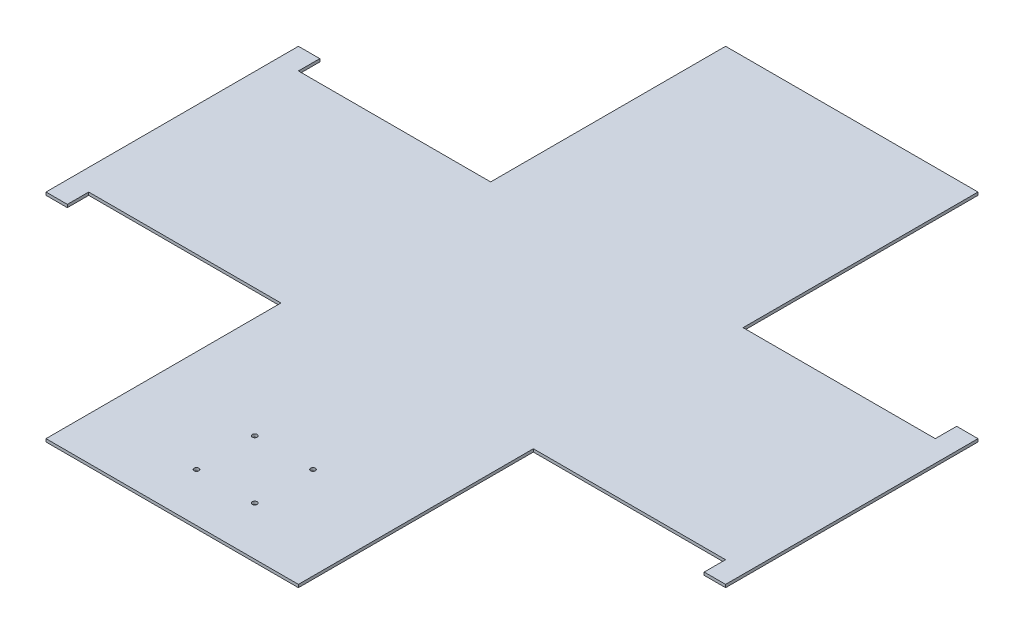
ISO-10303-21;
HEADER;
FILE_DESCRIPTION(('STEP AP214'),'2;1');
FILE_NAME('part.step','',(''),(''),'','','');
FILE_SCHEMA(('AUTOMOTIVE_DESIGN { 1 0 10303 214 1 1 1 1 }'));
ENDSEC;
DATA;
#1=APPLICATION_CONTEXT('core data for automotive mechanical design processes');
#2=APPLICATION_PROTOCOL_DEFINITION('international standard','automotive_design',2000,#1);
#3=PRODUCT_CONTEXT('',#1,'mechanical');
#4=PRODUCT('Part','Part','',(#3));
#5=PRODUCT_RELATED_PRODUCT_CATEGORY('part','',(#4));
#6=PRODUCT_DEFINITION_FORMATION('','',#4);
#7=PRODUCT_DEFINITION_CONTEXT('part definition',#1,'design');
#8=PRODUCT_DEFINITION('design','',#6,#7);
#9=PRODUCT_DEFINITION_SHAPE('','',#8);
#10=(LENGTH_UNIT() NAMED_UNIT(*) SI_UNIT(.MILLI.,.METRE.));
#11=(NAMED_UNIT(*) PLANE_ANGLE_UNIT() SI_UNIT($,.RADIAN.));
#12=(NAMED_UNIT(*) SI_UNIT($,.STERADIAN.) SOLID_ANGLE_UNIT());
#13=UNCERTAINTY_MEASURE_WITH_UNIT(LENGTH_MEASURE(1.E-05),#10,'distance_accuracy_value','');
#14=(GEOMETRIC_REPRESENTATION_CONTEXT(3) GLOBAL_UNCERTAINTY_ASSIGNED_CONTEXT((#13)) GLOBAL_UNIT_ASSIGNED_CONTEXT((#10,
#11,#12)) REPRESENTATION_CONTEXT('',''));
#15=CARTESIAN_POINT('',(0.,0.,0.));
#16=DIRECTION('',(0.,0.,1.));
#17=DIRECTION('',(1.,0.,0.));
#18=AXIS2_PLACEMENT_3D('',#15,#16,#17);
#19=CARTESIAN_POINT('',(-328.,3.,-108.));
#20=DIRECTION('',(0.,0.,1.));
#21=DIRECTION('',(1.,0.,0.));
#22=AXIS2_PLACEMENT_3D('',#19,#20,#21);
#23=PLANE('',#22);
#24=DIRECTION('',(-1.,0.,0.));
#25=VECTOR('',#24,1.);
#26=CARTESIAN_POINT('',(-328.,0.,-108.));
#27=LINE('',#26,#25);
#28=CARTESIAN_POINT('',(-130.,0.,-108.));
#29=VERTEX_POINT('',#28);
#30=CARTESIAN_POINT('',(-328.,0.,-108.));
#31=VERTEX_POINT('',#30);
#32=EDGE_CURVE('E211',#29,#31,#27,.T.);
#33=ORIENTED_EDGE('',*,*,#32,.T.);
#34=DIRECTION('',(0.,-1.,0.));
#35=VECTOR('',#34,1.);
#36=CARTESIAN_POINT('',(-328.,3.,-108.));
#37=LINE('',#36,#35);
#38=CARTESIAN_POINT('',(-328.,3.,-108.));
#39=VERTEX_POINT('',#38);
#40=EDGE_CURVE('E47',#39,#31,#37,.T.);
#41=ORIENTED_EDGE('',*,*,#40,.F.);
#42=DIRECTION('',(-1.,0.,0.));
#43=VECTOR('',#42,1.);
#44=CARTESIAN_POINT('',(-328.,3.,-108.));
#45=LINE('',#44,#43);
#46=CARTESIAN_POINT('',(-130.,3.,-108.));
#47=VERTEX_POINT('',#46);
#48=EDGE_CURVE('E134',#47,#39,#45,.T.);
#49=ORIENTED_EDGE('',*,*,#48,.F.);
#50=DIRECTION('',(0.,-1.,0.));
#51=VECTOR('',#50,1.);
#52=CARTESIAN_POINT('',(-130.,3.,-108.));
#53=LINE('',#52,#51);
#54=EDGE_CURVE('E11',#47,#29,#53,.T.);
#55=ORIENTED_EDGE('',*,*,#54,.T.);
#56=EDGE_LOOP('',(#33,#41,#49,#55));
#57=FACE_BOUND('',#56,.T.);
#58=ADVANCED_FACE('F39',(#57),#23,.F.);
#59=CARTESIAN_POINT('',(-328.,3.,-130.));
#60=DIRECTION('',(-1.,0.,0.));
#61=DIRECTION('',(0.,0.,1.));
#62=AXIS2_PLACEMENT_3D('',#59,#60,#61);
#63=PLANE('',#62);
#64=DIRECTION('',(0.,0.,-1.));
#65=VECTOR('',#64,1.);
#66=CARTESIAN_POINT('',(-328.,0.,-130.));
#67=LINE('',#66,#65);
#68=CARTESIAN_POINT('',(-328.,0.,-130.));
#69=VERTEX_POINT('',#68);
#70=EDGE_CURVE('E213',#31,#69,#67,.T.);
#71=ORIENTED_EDGE('',*,*,#70,.T.);
#72=DIRECTION('',(0.,-1.,0.));
#73=VECTOR('',#72,1.);
#74=CARTESIAN_POINT('',(-328.,3.,-130.));
#75=LINE('',#74,#73);
#76=CARTESIAN_POINT('',(-328.,3.,-130.));
#77=VERTEX_POINT('',#76);
#78=EDGE_CURVE('E293',#77,#69,#75,.T.);
#79=ORIENTED_EDGE('',*,*,#78,.F.);
#80=DIRECTION('',(0.,0.,-1.));
#81=VECTOR('',#80,1.);
#82=CARTESIAN_POINT('',(-328.,3.,-130.));
#83=LINE('',#82,#81);
#84=EDGE_CURVE('E301',#39,#77,#83,.T.);
#85=ORIENTED_EDGE('',*,*,#84,.F.);
#86=ORIENTED_EDGE('',*,*,#40,.T.);
#87=EDGE_LOOP('',(#71,#79,#85,#86));
#88=FACE_BOUND('',#87,.T.);
#89=ADVANCED_FACE('F299',(#88),#63,.F.);
#90=CARTESIAN_POINT('',(-350.,3.,-130.));
#91=DIRECTION('',(0.,0.,1.));
#92=DIRECTION('',(1.,0.,0.));
#93=AXIS2_PLACEMENT_3D('',#90,#91,#92);
#94=PLANE('',#93);
#95=DIRECTION('',(-1.,0.,0.));
#96=VECTOR('',#95,1.);
#97=CARTESIAN_POINT('',(-350.,0.,-130.));
#98=LINE('',#97,#96);
#99=CARTESIAN_POINT('',(-350.,0.,-130.));
#100=VERTEX_POINT('',#99);
#101=EDGE_CURVE('E216',#69,#100,#98,.T.);
#102=ORIENTED_EDGE('',*,*,#101,.T.);
#103=DIRECTION('',(0.,-1.,0.));
#104=VECTOR('',#103,1.);
#105=CARTESIAN_POINT('',(-350.,3.,-130.));
#106=LINE('',#105,#104);
#107=CARTESIAN_POINT('',(-350.,3.,-130.));
#108=VERTEX_POINT('',#107);
#109=EDGE_CURVE('E290',#108,#100,#106,.T.);
#110=ORIENTED_EDGE('',*,*,#109,.F.);
#111=DIRECTION('',(-1.,0.,0.));
#112=VECTOR('',#111,1.);
#113=CARTESIAN_POINT('',(-350.,3.,-130.));
#114=LINE('',#113,#112);
#115=EDGE_CURVE('E320',#77,#108,#114,.T.);
#116=ORIENTED_EDGE('',*,*,#115,.F.);
#117=ORIENTED_EDGE('',*,*,#78,.T.);
#118=EDGE_LOOP('',(#102,#110,#116,#117));
#119=FACE_BOUND('',#118,.T.);
#120=ADVANCED_FACE('F311',(#119),#94,.F.);
#121=CARTESIAN_POINT('',(-350.,3.,130.));
#122=DIRECTION('',(1.,0.,0.));
#123=DIRECTION('',(0.,0.,-1.));
#124=AXIS2_PLACEMENT_3D('',#121,#122,#123);
#125=PLANE('',#124);
#126=DIRECTION('',(0.,0.,1.));
#127=VECTOR('',#126,1.);
#128=CARTESIAN_POINT('',(-350.,0.,130.));
#129=LINE('',#128,#127);
#130=CARTESIAN_POINT('',(-350.,0.,130.));
#131=VERTEX_POINT('',#130);
#132=EDGE_CURVE('E218',#100,#131,#129,.T.);
#133=ORIENTED_EDGE('',*,*,#132,.T.);
#134=DIRECTION('',(0.,-1.,0.));
#135=VECTOR('',#134,1.);
#136=CARTESIAN_POINT('',(-350.,3.,130.));
#137=LINE('',#136,#135);
#138=CARTESIAN_POINT('',(-350.,3.,130.));
#139=VERTEX_POINT('',#138);
#140=EDGE_CURVE('E287',#139,#131,#137,.T.);
#141=ORIENTED_EDGE('',*,*,#140,.F.);
#142=DIRECTION('',(0.,0.,1.));
#143=VECTOR('',#142,1.);
#144=CARTESIAN_POINT('',(-350.,3.,130.));
#145=LINE('',#144,#143);
#146=EDGE_CURVE('E317',#108,#139,#145,.T.);
#147=ORIENTED_EDGE('',*,*,#146,.F.);
#148=ORIENTED_EDGE('',*,*,#109,.T.);
#149=EDGE_LOOP('',(#133,#141,#147,#148));
#150=FACE_BOUND('',#149,.T.);
#151=ADVANCED_FACE('F315',(#150),#125,.F.);
#152=CARTESIAN_POINT('',(-350.,3.,130.));
#153=DIRECTION('',(0.,0.,-1.));
#154=DIRECTION('',(-1.,0.,0.));
#155=AXIS2_PLACEMENT_3D('',#152,#153,#154);
#156=PLANE('',#155);
#157=DIRECTION('',(1.,0.,0.));
#158=VECTOR('',#157,1.);
#159=CARTESIAN_POINT('',(-350.,0.,130.));
#160=LINE('',#159,#158);
#161=CARTESIAN_POINT('',(-328.,0.,130.));
#162=VERTEX_POINT('',#161);
#163=EDGE_CURVE('E220',#131,#162,#160,.T.);
#164=ORIENTED_EDGE('',*,*,#163,.T.);
#165=DIRECTION('',(0.,-1.,0.));
#166=VECTOR('',#165,1.);
#167=CARTESIAN_POINT('',(-328.,3.,130.));
#168=LINE('',#167,#166);
#169=CARTESIAN_POINT('',(-328.,3.,130.));
#170=VERTEX_POINT('',#169);
#171=EDGE_CURVE('E284',#170,#162,#168,.T.);
#172=ORIENTED_EDGE('',*,*,#171,.F.);
#173=DIRECTION('',(1.,0.,0.));
#174=VECTOR('',#173,1.);
#175=CARTESIAN_POINT('',(-350.,3.,130.));
#176=LINE('',#175,#174);
#177=EDGE_CURVE('E319',#139,#170,#176,.T.);
#178=ORIENTED_EDGE('',*,*,#177,.F.);
#179=ORIENTED_EDGE('',*,*,#140,.T.);
#180=EDGE_LOOP('',(#164,#172,#178,#179));
#181=FACE_BOUND('',#180,.T.);
#182=ADVANCED_FACE('F416',(#181),#156,.F.);
#183=CARTESIAN_POINT('',(-328.,3.,108.));
#184=DIRECTION('',(-1.,0.,0.));
#185=DIRECTION('',(0.,0.,1.));
#186=AXIS2_PLACEMENT_3D('',#183,#184,#185);
#187=PLANE('',#186);
#188=DIRECTION('',(0.,0.,-1.));
#189=VECTOR('',#188,1.);
#190=CARTESIAN_POINT('',(-328.,0.,108.));
#191=LINE('',#190,#189);
#192=CARTESIAN_POINT('',(-328.,0.,108.));
#193=VERTEX_POINT('',#192);
#194=EDGE_CURVE('E222',#162,#193,#191,.T.);
#195=ORIENTED_EDGE('',*,*,#194,.T.);
#196=DIRECTION('',(0.,-1.,0.));
#197=VECTOR('',#196,1.);
#198=CARTESIAN_POINT('',(-328.,3.,108.));
#199=LINE('',#198,#197);
#200=CARTESIAN_POINT('',(-328.,3.,108.));
#201=VERTEX_POINT('',#200);
#202=EDGE_CURVE('E281',#201,#193,#199,.T.);
#203=ORIENTED_EDGE('',*,*,#202,.F.);
#204=DIRECTION('',(0.,0.,-1.));
#205=VECTOR('',#204,1.);
#206=CARTESIAN_POINT('',(-328.,3.,108.));
#207=LINE('',#206,#205);
#208=EDGE_CURVE('E322',#170,#201,#207,.T.);
#209=ORIENTED_EDGE('',*,*,#208,.F.);
#210=ORIENTED_EDGE('',*,*,#171,.T.);
#211=EDGE_LOOP('',(#195,#203,#209,#210));
#212=FACE_BOUND('',#211,.T.);
#213=ADVANCED_FACE('F419',(#212),#187,.F.);
#214=CARTESIAN_POINT('',(-328.,3.,108.));
#215=DIRECTION('',(0.,0.,-1.));
#216=DIRECTION('',(-1.,0.,0.));
#217=AXIS2_PLACEMENT_3D('',#214,#215,#216);
#218=PLANE('',#217);
#219=DIRECTION('',(1.,0.,0.));
#220=VECTOR('',#219,1.);
#221=CARTESIAN_POINT('',(-328.,0.,108.));
#222=LINE('',#221,#220);
#223=CARTESIAN_POINT('',(-130.,0.,108.));
#224=VERTEX_POINT('',#223);
#225=EDGE_CURVE('E224',#193,#224,#222,.T.);
#226=ORIENTED_EDGE('',*,*,#225,.T.);
#227=DIRECTION('',(0.,-1.,0.));
#228=VECTOR('',#227,1.);
#229=CARTESIAN_POINT('',(-130.,3.,108.));
#230=LINE('',#229,#228);
#231=CARTESIAN_POINT('',(-130.,3.,108.));
#232=VERTEX_POINT('',#231);
#233=EDGE_CURVE('E278',#232,#224,#230,.T.);
#234=ORIENTED_EDGE('',*,*,#233,.F.);
#235=DIRECTION('',(1.,0.,0.));
#236=VECTOR('',#235,1.);
#237=CARTESIAN_POINT('',(-328.,3.,108.));
#238=LINE('',#237,#236);
#239=EDGE_CURVE('E328',#201,#232,#238,.T.);
#240=ORIENTED_EDGE('',*,*,#239,.F.);
#241=ORIENTED_EDGE('',*,*,#202,.T.);
#242=EDGE_LOOP('',(#226,#234,#240,#241));
#243=FACE_BOUND('',#242,.T.);
#244=ADVANCED_FACE('F423',(#243),#218,.F.);
#245=CARTESIAN_POINT('',(-130.,3.,130.));
#246=DIRECTION('',(1.,0.,0.));
#247=DIRECTION('',(0.,0.,-1.));
#248=AXIS2_PLACEMENT_3D('',#245,#246,#247);
#249=PLANE('',#248);
#250=DIRECTION('',(0.,0.,1.));
#251=VECTOR('',#250,1.);
#252=CARTESIAN_POINT('',(-130.,0.,130.));
#253=LINE('',#252,#251);
#254=CARTESIAN_POINT('',(-130.,0.,350.));
#255=VERTEX_POINT('',#254);
#256=EDGE_CURVE('E227',#224,#255,#253,.T.);
#257=ORIENTED_EDGE('',*,*,#256,.T.);
#258=DIRECTION('',(0.,-1.,0.));
#259=VECTOR('',#258,1.);
#260=CARTESIAN_POINT('',(-130.,3.,350.));
#261=LINE('',#260,#259);
#262=CARTESIAN_POINT('',(-130.,3.,350.));
#263=VERTEX_POINT('',#262);
#264=EDGE_CURVE('E275',#263,#255,#261,.T.);
#265=ORIENTED_EDGE('',*,*,#264,.F.);
#266=DIRECTION('',(0.,0.,1.));
#267=VECTOR('',#266,1.);
#268=CARTESIAN_POINT('',(-130.,3.,108.));
#269=LINE('',#268,#267);
#270=EDGE_CURVE('E330',#232,#263,#269,.T.);
#271=ORIENTED_EDGE('',*,*,#270,.F.);
#272=ORIENTED_EDGE('',*,*,#233,.T.);
#273=EDGE_LOOP('',(#257,#265,#271,#272));
#274=FACE_BOUND('',#273,.T.);
#275=ADVANCED_FACE('F427',(#274),#249,.F.);
#276=CARTESIAN_POINT('',(-130.,3.,350.));
#277=DIRECTION('',(0.,0.,-1.));
#278=DIRECTION('',(-1.,0.,0.));
#279=AXIS2_PLACEMENT_3D('',#276,#277,#278);
#280=PLANE('',#279);
#281=DIRECTION('',(1.,0.,0.));
#282=VECTOR('',#281,1.);
#283=CARTESIAN_POINT('',(-130.,0.,350.));
#284=LINE('',#283,#282);
#285=CARTESIAN_POINT('',(130.,0.,350.));
#286=VERTEX_POINT('',#285);
#287=EDGE_CURVE('E229',#255,#286,#284,.T.);
#288=ORIENTED_EDGE('',*,*,#287,.T.);
#289=DIRECTION('',(0.,-1.,0.));
#290=VECTOR('',#289,1.);
#291=CARTESIAN_POINT('',(130.,3.,350.));
#292=LINE('',#291,#290);
#293=CARTESIAN_POINT('',(130.,3.,350.));
#294=VERTEX_POINT('',#293);
#295=EDGE_CURVE('E272',#294,#286,#292,.T.);
#296=ORIENTED_EDGE('',*,*,#295,.F.);
#297=DIRECTION('',(1.,0.,0.));
#298=VECTOR('',#297,1.);
#299=CARTESIAN_POINT('',(-130.,3.,350.));
#300=LINE('',#299,#298);
#301=EDGE_CURVE('E332',#263,#294,#300,.T.);
#302=ORIENTED_EDGE('',*,*,#301,.F.);
#303=ORIENTED_EDGE('',*,*,#264,.T.);
#304=EDGE_LOOP('',(#288,#296,#302,#303));
#305=FACE_BOUND('',#304,.T.);
#306=ADVANCED_FACE('F431',(#305),#280,.F.);
#307=CARTESIAN_POINT('',(130.,3.,108.));
#308=DIRECTION('',(-1.,0.,0.));
#309=DIRECTION('',(0.,0.,1.));
#310=AXIS2_PLACEMENT_3D('',#307,#308,#309);
#311=PLANE('',#310);
#312=DIRECTION('',(0.,0.,-1.));
#313=VECTOR('',#312,1.);
#314=CARTESIAN_POINT('',(130.,0.,108.));
#315=LINE('',#314,#313);
#316=CARTESIAN_POINT('',(130.,0.,108.));
#317=VERTEX_POINT('',#316);
#318=EDGE_CURVE('E232',#286,#317,#315,.T.);
#319=ORIENTED_EDGE('',*,*,#318,.T.);
#320=DIRECTION('',(0.,-1.,0.));
#321=VECTOR('',#320,1.);
#322=CARTESIAN_POINT('',(130.,3.,108.));
#323=LINE('',#322,#321);
#324=CARTESIAN_POINT('',(130.,3.,108.));
#325=VERTEX_POINT('',#324);
#326=EDGE_CURVE('E269',#325,#317,#323,.T.);
#327=ORIENTED_EDGE('',*,*,#326,.F.);
#328=DIRECTION('',(0.,0.,-1.));
#329=VECTOR('',#328,1.);
#330=CARTESIAN_POINT('',(130.,3.,130.));
#331=LINE('',#330,#329);
#332=EDGE_CURVE('E334',#294,#325,#331,.T.);
#333=ORIENTED_EDGE('',*,*,#332,.F.);
#334=ORIENTED_EDGE('',*,*,#295,.T.);
#335=EDGE_LOOP('',(#319,#327,#333,#334));
#336=FACE_BOUND('',#335,.T.);
#337=ADVANCED_FACE('F435',(#336),#311,.F.);
#338=CARTESIAN_POINT('',(130.,3.,108.));
#339=DIRECTION('',(0.,0.,-1.));
#340=DIRECTION('',(-1.,0.,0.));
#341=AXIS2_PLACEMENT_3D('',#338,#339,#340);
#342=PLANE('',#341);
#343=DIRECTION('',(1.,0.,0.));
#344=VECTOR('',#343,1.);
#345=CARTESIAN_POINT('',(130.,0.,108.));
#346=LINE('',#345,#344);
#347=CARTESIAN_POINT('',(328.,0.,108.));
#348=VERTEX_POINT('',#347);
#349=EDGE_CURVE('E234',#317,#348,#346,.T.);
#350=ORIENTED_EDGE('',*,*,#349,.T.);
#351=DIRECTION('',(0.,-1.,0.));
#352=VECTOR('',#351,1.);
#353=CARTESIAN_POINT('',(328.,3.,108.));
#354=LINE('',#353,#352);
#355=CARTESIAN_POINT('',(328.,3.,108.));
#356=VERTEX_POINT('',#355);
#357=EDGE_CURVE('E266',#356,#348,#354,.T.);
#358=ORIENTED_EDGE('',*,*,#357,.F.);
#359=DIRECTION('',(1.,0.,0.));
#360=VECTOR('',#359,1.);
#361=CARTESIAN_POINT('',(130.,3.,108.));
#362=LINE('',#361,#360);
#363=EDGE_CURVE('E336',#325,#356,#362,.T.);
#364=ORIENTED_EDGE('',*,*,#363,.F.);
#365=ORIENTED_EDGE('',*,*,#326,.T.);
#366=EDGE_LOOP('',(#350,#358,#364,#365));
#367=FACE_BOUND('',#366,.T.);
#368=ADVANCED_FACE('F439',(#367),#342,.F.);
#369=CARTESIAN_POINT('',(328.,3.,108.));
#370=DIRECTION('',(1.,0.,0.));
#371=DIRECTION('',(0.,0.,-1.));
#372=AXIS2_PLACEMENT_3D('',#369,#370,#371);
#373=PLANE('',#372);
#374=DIRECTION('',(0.,0.,1.));
#375=VECTOR('',#374,1.);
#376=CARTESIAN_POINT('',(328.,0.,108.));
#377=LINE('',#376,#375);
#378=CARTESIAN_POINT('',(328.,0.,130.));
#379=VERTEX_POINT('',#378);
#380=EDGE_CURVE('E236',#348,#379,#377,.T.);
#381=ORIENTED_EDGE('',*,*,#380,.T.);
#382=DIRECTION('',(0.,-1.,0.));
#383=VECTOR('',#382,1.);
#384=CARTESIAN_POINT('',(328.,3.,130.));
#385=LINE('',#384,#383);
#386=CARTESIAN_POINT('',(328.,3.,130.));
#387=VERTEX_POINT('',#386);
#388=EDGE_CURVE('E263',#387,#379,#385,.T.);
#389=ORIENTED_EDGE('',*,*,#388,.F.);
#390=DIRECTION('',(0.,0.,1.));
#391=VECTOR('',#390,1.);
#392=CARTESIAN_POINT('',(328.,3.,108.));
#393=LINE('',#392,#391);
#394=EDGE_CURVE('E338',#356,#387,#393,.T.);
#395=ORIENTED_EDGE('',*,*,#394,.F.);
#396=ORIENTED_EDGE('',*,*,#357,.T.);
#397=EDGE_LOOP('',(#381,#389,#395,#396));
#398=FACE_BOUND('',#397,.T.);
#399=ADVANCED_FACE('F443',(#398),#373,.F.);
#400=CARTESIAN_POINT('',(328.,3.,130.));
#401=DIRECTION('',(0.,0.,-1.));
#402=DIRECTION('',(-1.,0.,0.));
#403=AXIS2_PLACEMENT_3D('',#400,#401,#402);
#404=PLANE('',#403);
#405=DIRECTION('',(1.,0.,0.));
#406=VECTOR('',#405,1.);
#407=CARTESIAN_POINT('',(328.,0.,130.));
#408=LINE('',#407,#406);
#409=CARTESIAN_POINT('',(350.,0.,130.));
#410=VERTEX_POINT('',#409);
#411=EDGE_CURVE('E238',#379,#410,#408,.T.);
#412=ORIENTED_EDGE('',*,*,#411,.T.);
#413=DIRECTION('',(0.,-1.,0.));
#414=VECTOR('',#413,1.);
#415=CARTESIAN_POINT('',(350.,3.,130.));
#416=LINE('',#415,#414);
#417=CARTESIAN_POINT('',(350.,3.,130.));
#418=VERTEX_POINT('',#417);
#419=EDGE_CURVE('E260',#418,#410,#416,.T.);
#420=ORIENTED_EDGE('',*,*,#419,.F.);
#421=DIRECTION('',(1.,0.,0.));
#422=VECTOR('',#421,1.);
#423=CARTESIAN_POINT('',(328.,3.,130.));
#424=LINE('',#423,#422);
#425=EDGE_CURVE('E340',#387,#418,#424,.T.);
#426=ORIENTED_EDGE('',*,*,#425,.F.);
#427=ORIENTED_EDGE('',*,*,#388,.T.);
#428=EDGE_LOOP('',(#412,#420,#426,#427));
#429=FACE_BOUND('',#428,.T.);
#430=ADVANCED_FACE('F447',(#429),#404,.F.);
#431=CARTESIAN_POINT('',(350.,3.,130.));
#432=DIRECTION('',(-1.,0.,0.));
#433=DIRECTION('',(0.,0.,1.));
#434=AXIS2_PLACEMENT_3D('',#431,#432,#433);
#435=PLANE('',#434);
#436=DIRECTION('',(0.,0.,-1.));
#437=VECTOR('',#436,1.);
#438=CARTESIAN_POINT('',(350.,0.,130.));
#439=LINE('',#438,#437);
#440=CARTESIAN_POINT('',(350.,0.,-130.));
#441=VERTEX_POINT('',#440);
#442=EDGE_CURVE('E240',#410,#441,#439,.T.);
#443=ORIENTED_EDGE('',*,*,#442,.T.);
#444=DIRECTION('',(0.,-1.,0.));
#445=VECTOR('',#444,1.);
#446=CARTESIAN_POINT('',(350.,3.,-130.));
#447=LINE('',#446,#445);
#448=CARTESIAN_POINT('',(350.,3.,-130.));
#449=VERTEX_POINT('',#448);
#450=EDGE_CURVE('E257',#449,#441,#447,.T.);
#451=ORIENTED_EDGE('',*,*,#450,.F.);
#452=DIRECTION('',(0.,0.,-1.));
#453=VECTOR('',#452,1.);
#454=CARTESIAN_POINT('',(350.,3.,130.));
#455=LINE('',#454,#453);
#456=EDGE_CURVE('E342',#418,#449,#455,.T.);
#457=ORIENTED_EDGE('',*,*,#456,.F.);
#458=ORIENTED_EDGE('',*,*,#419,.T.);
#459=EDGE_LOOP('',(#443,#451,#457,#458));
#460=FACE_BOUND('',#459,.T.);
#461=ADVANCED_FACE('F451',(#460),#435,.F.);
#462=CARTESIAN_POINT('',(328.,3.,-130.));
#463=DIRECTION('',(0.,0.,1.));
#464=DIRECTION('',(1.,0.,0.));
#465=AXIS2_PLACEMENT_3D('',#462,#463,#464);
#466=PLANE('',#465);
#467=DIRECTION('',(-1.,0.,0.));
#468=VECTOR('',#467,1.);
#469=CARTESIAN_POINT('',(328.,0.,-130.));
#470=LINE('',#469,#468);
#471=CARTESIAN_POINT('',(328.,0.,-130.));
#472=VERTEX_POINT('',#471);
#473=EDGE_CURVE('E242',#441,#472,#470,.T.);
#474=ORIENTED_EDGE('',*,*,#473,.T.);
#475=DIRECTION('',(0.,-1.,0.));
#476=VECTOR('',#475,1.);
#477=CARTESIAN_POINT('',(328.,3.,-130.));
#478=LINE('',#477,#476);
#479=CARTESIAN_POINT('',(328.,3.,-130.));
#480=VERTEX_POINT('',#479);
#481=EDGE_CURVE('E254',#480,#472,#478,.T.);
#482=ORIENTED_EDGE('',*,*,#481,.F.);
#483=DIRECTION('',(-1.,0.,0.));
#484=VECTOR('',#483,1.);
#485=CARTESIAN_POINT('',(328.,3.,-130.));
#486=LINE('',#485,#484);
#487=EDGE_CURVE('E344',#449,#480,#486,.T.);
#488=ORIENTED_EDGE('',*,*,#487,.F.);
#489=ORIENTED_EDGE('',*,*,#450,.T.);
#490=EDGE_LOOP('',(#474,#482,#488,#489));
#491=FACE_BOUND('',#490,.T.);
#492=ADVANCED_FACE('F350',(#491),#466,.F.);
#493=CARTESIAN_POINT('',(328.,3.,-130.));
#494=DIRECTION('',(1.,0.,0.));
#495=DIRECTION('',(0.,0.,-1.));
#496=AXIS2_PLACEMENT_3D('',#493,#494,#495);
#497=PLANE('',#496);
#498=DIRECTION('',(0.,0.,1.));
#499=VECTOR('',#498,1.);
#500=CARTESIAN_POINT('',(328.,0.,-130.));
#501=LINE('',#500,#499);
#502=CARTESIAN_POINT('',(328.,0.,-108.));
#503=VERTEX_POINT('',#502);
#504=EDGE_CURVE('E244',#472,#503,#501,.T.);
#505=ORIENTED_EDGE('',*,*,#504,.T.);
#506=DIRECTION('',(0.,-1.,0.));
#507=VECTOR('',#506,1.);
#508=CARTESIAN_POINT('',(328.,3.,-108.));
#509=LINE('',#508,#507);
#510=CARTESIAN_POINT('',(328.,3.,-108.));
#511=VERTEX_POINT('',#510);
#512=EDGE_CURVE('E200',#511,#503,#509,.T.);
#513=ORIENTED_EDGE('',*,*,#512,.F.);
#514=DIRECTION('',(0.,0.,1.));
#515=VECTOR('',#514,1.);
#516=CARTESIAN_POINT('',(328.,3.,-130.));
#517=LINE('',#516,#515);
#518=EDGE_CURVE('E190',#480,#511,#517,.T.);
#519=ORIENTED_EDGE('',*,*,#518,.F.);
#520=ORIENTED_EDGE('',*,*,#481,.T.);
#521=EDGE_LOOP('',(#505,#513,#519,#520));
#522=FACE_BOUND('',#521,.T.);
#523=ADVANCED_FACE('F354',(#522),#497,.F.);
#524=CARTESIAN_POINT('',(130.,3.,-108.));
#525=DIRECTION('',(0.,0.,1.));
#526=DIRECTION('',(1.,0.,0.));
#527=AXIS2_PLACEMENT_3D('',#524,#525,#526);
#528=PLANE('',#527);
#529=DIRECTION('',(-1.,0.,0.));
#530=VECTOR('',#529,1.);
#531=CARTESIAN_POINT('',(130.,0.,-108.));
#532=LINE('',#531,#530);
#533=CARTESIAN_POINT('',(130.,0.,-108.));
#534=VERTEX_POINT('',#533);
#535=EDGE_CURVE('E199',#503,#534,#532,.T.);
#536=ORIENTED_EDGE('',*,*,#535,.T.);
#537=DIRECTION('',(0.,-1.,0.));
#538=VECTOR('',#537,1.);
#539=CARTESIAN_POINT('',(130.,3.,-108.));
#540=LINE('',#539,#538);
#541=CARTESIAN_POINT('',(130.,3.,-108.));
#542=VERTEX_POINT('',#541);
#543=EDGE_CURVE('E196',#542,#534,#540,.T.);
#544=ORIENTED_EDGE('',*,*,#543,.F.);
#545=DIRECTION('',(-1.,0.,0.));
#546=VECTOR('',#545,1.);
#547=CARTESIAN_POINT('',(130.,3.,-108.));
#548=LINE('',#547,#546);
#549=EDGE_CURVE('E184',#511,#542,#548,.T.);
#550=ORIENTED_EDGE('',*,*,#549,.F.);
#551=ORIENTED_EDGE('',*,*,#512,.T.);
#552=EDGE_LOOP('',(#536,#544,#550,#551));
#553=FACE_BOUND('',#552,.T.);
#554=ADVANCED_FACE('F197',(#553),#528,.F.);
#555=CARTESIAN_POINT('',(130.,3.,-350.));
#556=DIRECTION('',(-1.,0.,0.));
#557=DIRECTION('',(0.,0.,1.));
#558=AXIS2_PLACEMENT_3D('',#555,#556,#557);
#559=PLANE('',#558);
#560=DIRECTION('',(0.,0.,-1.));
#561=VECTOR('',#560,1.);
#562=CARTESIAN_POINT('',(130.,0.,-350.));
#563=LINE('',#562,#561);
#564=CARTESIAN_POINT('',(130.,0.,-350.));
#565=VERTEX_POINT('',#564);
#566=EDGE_CURVE('E120',#534,#565,#563,.T.);
#567=ORIENTED_EDGE('',*,*,#566,.T.);
#568=DIRECTION('',(0.,-1.,0.));
#569=VECTOR('',#568,1.);
#570=CARTESIAN_POINT('',(130.,3.,-350.));
#571=LINE('',#570,#569);
#572=CARTESIAN_POINT('',(130.,3.,-350.));
#573=VERTEX_POINT('',#572);
#574=EDGE_CURVE('E201',#573,#565,#571,.T.);
#575=ORIENTED_EDGE('',*,*,#574,.F.);
#576=DIRECTION('',(0.,0.,-1.));
#577=VECTOR('',#576,1.);
#578=CARTESIAN_POINT('',(130.,3.,-130.));
#579=LINE('',#578,#577);
#580=EDGE_CURVE('E188',#542,#573,#579,.T.);
#581=ORIENTED_EDGE('',*,*,#580,.F.);
#582=ORIENTED_EDGE('',*,*,#543,.T.);
#583=EDGE_LOOP('',(#567,#575,#581,#582));
#584=FACE_BOUND('',#583,.T.);
#585=ADVANCED_FACE('F203',(#584),#559,.F.);
#586=CARTESIAN_POINT('',(-130.,3.,-350.));
#587=DIRECTION('',(0.,0.,1.));
#588=DIRECTION('',(1.,0.,0.));
#589=AXIS2_PLACEMENT_3D('',#586,#587,#588);
#590=PLANE('',#589);
#591=DIRECTION('',(-1.,0.,0.));
#592=VECTOR('',#591,1.);
#593=CARTESIAN_POINT('',(-130.,0.,-350.));
#594=LINE('',#593,#592);
#595=CARTESIAN_POINT('',(-130.,0.,-350.));
#596=VERTEX_POINT('',#595);
#597=EDGE_CURVE('E127',#565,#596,#594,.T.);
#598=ORIENTED_EDGE('',*,*,#597,.T.);
#599=DIRECTION('',(0.,-1.,0.));
#600=VECTOR('',#599,1.);
#601=CARTESIAN_POINT('',(-130.,3.,-350.));
#602=LINE('',#601,#600);
#603=CARTESIAN_POINT('',(-130.,3.,-350.));
#604=VERTEX_POINT('',#603);
#605=EDGE_CURVE('E207',#604,#596,#602,.T.);
#606=ORIENTED_EDGE('',*,*,#605,.F.);
#607=DIRECTION('',(-1.,0.,0.));
#608=VECTOR('',#607,1.);
#609=CARTESIAN_POINT('',(-130.,3.,-350.));
#610=LINE('',#609,#608);
#611=EDGE_CURVE('E205',#573,#604,#610,.T.);
#612=ORIENTED_EDGE('',*,*,#611,.F.);
#613=ORIENTED_EDGE('',*,*,#574,.T.);
#614=EDGE_LOOP('',(#598,#606,#612,#613));
#615=FACE_BOUND('',#614,.T.);
#616=ADVANCED_FACE('F356',(#615),#590,.F.);
#617=CARTESIAN_POINT('',(-130.,3.,-350.));
#618=DIRECTION('',(1.,0.,0.));
#619=DIRECTION('',(0.,0.,-1.));
#620=AXIS2_PLACEMENT_3D('',#617,#618,#619);
#621=PLANE('',#620);
#622=DIRECTION('',(0.,0.,1.));
#623=VECTOR('',#622,1.);
#624=CARTESIAN_POINT('',(-130.,0.,-350.));
#625=LINE('',#624,#623);
#626=EDGE_CURVE('E249',#596,#29,#625,.T.);
#627=ORIENTED_EDGE('',*,*,#626,.T.);
#628=ORIENTED_EDGE('',*,*,#54,.F.);
#629=DIRECTION('',(0.,0.,1.));
#630=VECTOR('',#629,1.);
#631=CARTESIAN_POINT('',(-130.,3.,-130.));
#632=LINE('',#631,#630);
#633=EDGE_CURVE('E55',#604,#47,#632,.T.);
#634=ORIENTED_EDGE('',*,*,#633,.F.);
#635=ORIENTED_EDGE('',*,*,#605,.T.);
#636=EDGE_LOOP('',(#627,#628,#634,#635));
#637=FACE_BOUND('',#636,.T.);
#638=ADVANCED_FACE('F355',(#637),#621,.F.);
#639=CARTESIAN_POINT('',(0.,3.,0.));
#640=DIRECTION('',(0.,1.,0.));
#641=DIRECTION('',(0.,0.,1.));
#642=AXIS2_PLACEMENT_3D('',#639,#640,#641);
#643=PLANE('',#642);
#644=CARTESIAN_POINT('',(35.,3.,300.));
#645=DIRECTION('',(0.,-1.,0.));
#646=DIRECTION('',(0.,0.,-1.));
#647=AXIS2_PLACEMENT_3D('',#644,#645,#646);
#648=CIRCLE('',#647,2.5);
#649=CARTESIAN_POINT('',(35.,3.,297.5));
#650=VERTEX_POINT('',#649);
#651=EDGE_CURVE('E373',#650,#650,#648,.T.);
#652=ORIENTED_EDGE('',*,*,#651,.T.);
#653=EDGE_LOOP('',(#652));
#654=FACE_BOUND('',#653,.T.);
#655=CARTESIAN_POINT('',(-25.,3.,240.));
#656=DIRECTION('',(0.,-1.,0.));
#657=DIRECTION('',(0.,0.,-1.));
#658=AXIS2_PLACEMENT_3D('',#655,#656,#657);
#659=CIRCLE('',#658,2.50000000000002);
#660=CARTESIAN_POINT('',(-25.,3.,237.5));
#661=VERTEX_POINT('',#660);
#662=EDGE_CURVE('E366',#661,#661,#659,.T.);
#663=ORIENTED_EDGE('',*,*,#662,.T.);
#664=EDGE_LOOP('',(#663));
#665=FACE_BOUND('',#664,.T.);
#666=CARTESIAN_POINT('',(35.,3.,240.));
#667=DIRECTION('',(0.,-1.,0.));
#668=DIRECTION('',(0.,0.,-1.));
#669=AXIS2_PLACEMENT_3D('',#666,#667,#668);
#670=CIRCLE('',#669,2.5);
#671=CARTESIAN_POINT('',(35.,3.,237.5));
#672=VERTEX_POINT('',#671);
#673=EDGE_CURVE('E378',#672,#672,#670,.T.);
#674=ORIENTED_EDGE('',*,*,#673,.T.);
#675=EDGE_LOOP('',(#674));
#676=FACE_BOUND('',#675,.T.);
#677=CARTESIAN_POINT('',(-25.,3.,300.));
#678=DIRECTION('',(0.,-1.,0.));
#679=DIRECTION('',(0.,0.,-1.));
#680=AXIS2_PLACEMENT_3D('',#677,#678,#679);
#681=CIRCLE('',#680,2.50000000000002);
#682=CARTESIAN_POINT('',(-25.,3.,297.5));
#683=VERTEX_POINT('',#682);
#684=EDGE_CURVE('E214',#683,#683,#681,.T.);
#685=ORIENTED_EDGE('',*,*,#684,.T.);
#686=EDGE_LOOP('',(#685));
#687=FACE_BOUND('',#686,.T.);
#688=ORIENTED_EDGE('',*,*,#633,.T.);
#689=ORIENTED_EDGE('',*,*,#48,.T.);
#690=ORIENTED_EDGE('',*,*,#84,.T.);
#691=ORIENTED_EDGE('',*,*,#115,.T.);
#692=ORIENTED_EDGE('',*,*,#146,.T.);
#693=ORIENTED_EDGE('',*,*,#177,.T.);
#694=ORIENTED_EDGE('',*,*,#208,.T.);
#695=ORIENTED_EDGE('',*,*,#239,.T.);
#696=ORIENTED_EDGE('',*,*,#270,.T.);
#697=ORIENTED_EDGE('',*,*,#301,.T.);
#698=ORIENTED_EDGE('',*,*,#332,.T.);
#699=ORIENTED_EDGE('',*,*,#363,.T.);
#700=ORIENTED_EDGE('',*,*,#394,.T.);
#701=ORIENTED_EDGE('',*,*,#425,.T.);
#702=ORIENTED_EDGE('',*,*,#456,.T.);
#703=ORIENTED_EDGE('',*,*,#487,.T.);
#704=ORIENTED_EDGE('',*,*,#518,.T.);
#705=ORIENTED_EDGE('',*,*,#549,.T.);
#706=ORIENTED_EDGE('',*,*,#580,.T.);
#707=ORIENTED_EDGE('',*,*,#611,.T.);
#708=EDGE_LOOP('',(#688,#689,#690,#691,#692,#693,#694,#695,#696,#697,#698,#699,#700,#701,#702,
#703,#704,#705,#706,#707));
#709=FACE_BOUND('',#708,.T.);
#710=ADVANCED_FACE('F186',(#654,#665,#676,#687,#709),#643,.T.);
#711=CARTESIAN_POINT('',(0.,0.,0.));
#712=DIRECTION('',(0.,1.,0.));
#713=DIRECTION('',(0.,0.,1.));
#714=AXIS2_PLACEMENT_3D('',#711,#712,#713);
#715=PLANE('',#714);
#716=CARTESIAN_POINT('',(35.,0.,300.));
#717=DIRECTION('',(0.,-1.,0.));
#718=DIRECTION('',(0.,0.,-1.));
#719=AXIS2_PLACEMENT_3D('',#716,#717,#718);
#720=CIRCLE('',#719,2.5);
#721=CARTESIAN_POINT('',(35.,0.,297.5));
#722=VERTEX_POINT('',#721);
#723=EDGE_CURVE('E363',#722,#722,#720,.T.);
#724=ORIENTED_EDGE('',*,*,#723,.F.);
#725=EDGE_LOOP('',(#724));
#726=FACE_BOUND('',#725,.T.);
#727=CARTESIAN_POINT('',(-25.,0.,240.));
#728=DIRECTION('',(0.,-1.,0.));
#729=DIRECTION('',(0.,0.,-1.));
#730=AXIS2_PLACEMENT_3D('',#727,#728,#729);
#731=CIRCLE('',#730,2.50000000000002);
#732=CARTESIAN_POINT('',(-25.,0.,237.5));
#733=VERTEX_POINT('',#732);
#734=EDGE_CURVE('E369',#733,#733,#731,.T.);
#735=ORIENTED_EDGE('',*,*,#734,.F.);
#736=EDGE_LOOP('',(#735));
#737=FACE_BOUND('',#736,.T.);
#738=CARTESIAN_POINT('',(35.,0.,240.));
#739=DIRECTION('',(0.,-1.,0.));
#740=DIRECTION('',(0.,0.,-1.));
#741=AXIS2_PLACEMENT_3D('',#738,#739,#740);
#742=CIRCLE('',#741,2.5);
#743=CARTESIAN_POINT('',(35.,0.,237.5));
#744=VERTEX_POINT('',#743);
#745=EDGE_CURVE('E370',#744,#744,#742,.T.);
#746=ORIENTED_EDGE('',*,*,#745,.F.);
#747=EDGE_LOOP('',(#746));
#748=FACE_BOUND('',#747,.T.);
#749=CARTESIAN_POINT('',(-25.,0.,300.));
#750=DIRECTION('',(0.,-1.,0.));
#751=DIRECTION('',(0.,0.,-1.));
#752=AXIS2_PLACEMENT_3D('',#749,#750,#751);
#753=CIRCLE('',#752,2.50000000000002);
#754=CARTESIAN_POINT('',(-25.,0.,297.5));
#755=VERTEX_POINT('',#754);
#756=EDGE_CURVE('E360',#755,#755,#753,.T.);
#757=ORIENTED_EDGE('',*,*,#756,.F.);
#758=EDGE_LOOP('',(#757));
#759=FACE_BOUND('',#758,.T.);
#760=ORIENTED_EDGE('',*,*,#32,.F.);
#761=ORIENTED_EDGE('',*,*,#626,.F.);
#762=ORIENTED_EDGE('',*,*,#597,.F.);
#763=ORIENTED_EDGE('',*,*,#566,.F.);
#764=ORIENTED_EDGE('',*,*,#535,.F.);
#765=ORIENTED_EDGE('',*,*,#504,.F.);
#766=ORIENTED_EDGE('',*,*,#473,.F.);
#767=ORIENTED_EDGE('',*,*,#442,.F.);
#768=ORIENTED_EDGE('',*,*,#411,.F.);
#769=ORIENTED_EDGE('',*,*,#380,.F.);
#770=ORIENTED_EDGE('',*,*,#349,.F.);
#771=ORIENTED_EDGE('',*,*,#318,.F.);
#772=ORIENTED_EDGE('',*,*,#287,.F.);
#773=ORIENTED_EDGE('',*,*,#256,.F.);
#774=ORIENTED_EDGE('',*,*,#225,.F.);
#775=ORIENTED_EDGE('',*,*,#194,.F.);
#776=ORIENTED_EDGE('',*,*,#163,.F.);
#777=ORIENTED_EDGE('',*,*,#132,.F.);
#778=ORIENTED_EDGE('',*,*,#101,.F.);
#779=ORIENTED_EDGE('',*,*,#70,.F.);
#780=EDGE_LOOP('',(#760,#761,#762,#763,#764,#765,#766,#767,#768,#769,#770,#771,#772,#773,#774,
#775,#776,#777,#778,#779));
#781=FACE_BOUND('',#780,.T.);
#782=ADVANCED_FACE('F305',(#726,#737,#748,#759,#781),#715,.F.);
#783=CARTESIAN_POINT('',(-25.,3.,300.));
#784=DIRECTION('',(0.,-1.,0.));
#785=DIRECTION('',(0.,0.,-1.));
#786=AXIS2_PLACEMENT_3D('',#783,#784,#785);
#787=CYLINDRICAL_SURFACE('',#786,2.50000000000002);
#788=ORIENTED_EDGE('',*,*,#684,.F.);
#789=EDGE_LOOP('',(#788));
#790=FACE_BOUND('',#789,.T.);
#791=ORIENTED_EDGE('',*,*,#756,.T.);
#792=EDGE_LOOP('',(#791));
#793=FACE_BOUND('',#792,.T.);
#794=ADVANCED_FACE('F388',(#790,#793),#787,.F.);
#795=CARTESIAN_POINT('',(35.,3.,240.));
#796=DIRECTION('',(0.,-1.,0.));
#797=DIRECTION('',(0.,0.,-1.));
#798=AXIS2_PLACEMENT_3D('',#795,#796,#797);
#799=CYLINDRICAL_SURFACE('',#798,2.5);
#800=ORIENTED_EDGE('',*,*,#673,.F.);
#801=EDGE_LOOP('',(#800));
#802=FACE_BOUND('',#801,.T.);
#803=ORIENTED_EDGE('',*,*,#745,.T.);
#804=EDGE_LOOP('',(#803));
#805=FACE_BOUND('',#804,.T.);
#806=ADVANCED_FACE('F384',(#802,#805),#799,.F.);
#807=CARTESIAN_POINT('',(-25.,3.,240.));
#808=DIRECTION('',(0.,-1.,0.));
#809=DIRECTION('',(0.,0.,-1.));
#810=AXIS2_PLACEMENT_3D('',#807,#808,#809);
#811=CYLINDRICAL_SURFACE('',#810,2.50000000000002);
#812=ORIENTED_EDGE('',*,*,#662,.F.);
#813=EDGE_LOOP('',(#812));
#814=FACE_BOUND('',#813,.T.);
#815=ORIENTED_EDGE('',*,*,#734,.T.);
#816=EDGE_LOOP('',(#815));
#817=FACE_BOUND('',#816,.T.);
#818=ADVANCED_FACE('F399',(#814,#817),#811,.F.);
#819=CARTESIAN_POINT('',(35.,3.,300.));
#820=DIRECTION('',(0.,-1.,0.));
#821=DIRECTION('',(0.,0.,-1.));
#822=AXIS2_PLACEMENT_3D('',#819,#820,#821);
#823=CYLINDRICAL_SURFACE('',#822,2.5);
#824=ORIENTED_EDGE('',*,*,#651,.F.);
#825=EDGE_LOOP('',(#824));
#826=FACE_BOUND('',#825,.T.);
#827=ORIENTED_EDGE('',*,*,#723,.T.);
#828=EDGE_LOOP('',(#827));
#829=FACE_BOUND('',#828,.T.);
#830=ADVANCED_FACE('F480',(#826,#829),#823,.F.);
#831=CLOSED_SHELL('',(#58,#89,#120,#151,#182,#213,#244,#275,#306,#337,#368,#399,#430,#461,#492,
#523,#554,#585,#616,#638,#710,#782,#794,#806,#818,#830));
#832=MANIFOLD_SOLID_BREP('B2',#831);
#833=ADVANCED_BREP_SHAPE_REPRESENTATION('',(#18,#832),#14);
#834=SHAPE_DEFINITION_REPRESENTATION(#9,#833);
ENDSEC;
END-ISO-10303-21;
